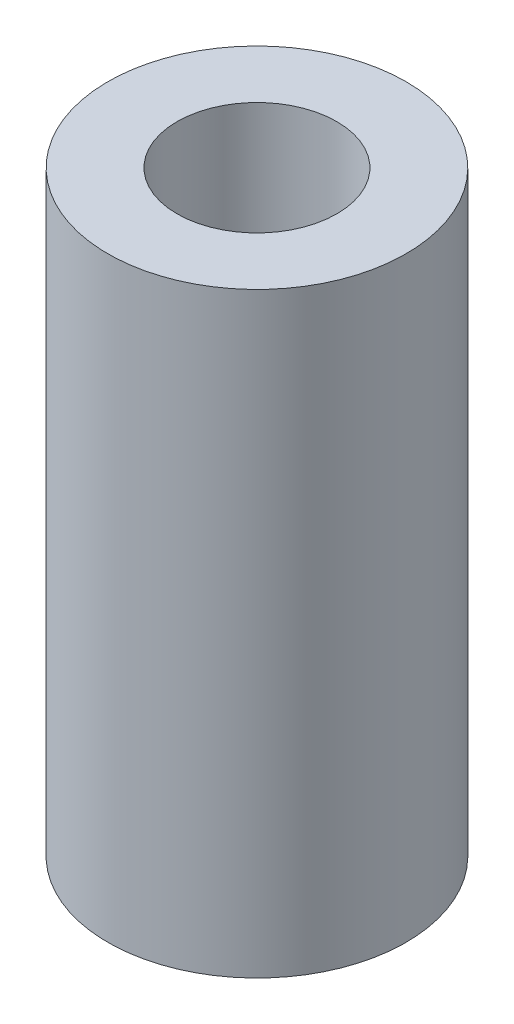
ISO-10303-21;
HEADER;
FILE_DESCRIPTION(('STEP AP214'),'2;1');
FILE_NAME('part.step','',(''),(''),'','','');
FILE_SCHEMA(('AUTOMOTIVE_DESIGN { 1 0 10303 214 1 1 1 1 }'));
ENDSEC;
DATA;
#1=APPLICATION_CONTEXT('core data for automotive mechanical design processes');
#2=APPLICATION_PROTOCOL_DEFINITION('international standard','automotive_design',2000,#1);
#3=PRODUCT_CONTEXT('',#1,'mechanical');
#4=PRODUCT('Part','Part','',(#3));
#5=PRODUCT_RELATED_PRODUCT_CATEGORY('part','',(#4));
#6=PRODUCT_DEFINITION_FORMATION('','',#4);
#7=PRODUCT_DEFINITION_CONTEXT('part definition',#1,'design');
#8=PRODUCT_DEFINITION('design','',#6,#7);
#9=PRODUCT_DEFINITION_SHAPE('','',#8);
#10=(LENGTH_UNIT() NAMED_UNIT(*) SI_UNIT(.MILLI.,.METRE.));
#11=(NAMED_UNIT(*) PLANE_ANGLE_UNIT() SI_UNIT($,.RADIAN.));
#12=(NAMED_UNIT(*) SI_UNIT($,.STERADIAN.) SOLID_ANGLE_UNIT());
#13=UNCERTAINTY_MEASURE_WITH_UNIT(LENGTH_MEASURE(1.E-05),#10,'distance_accuracy_value','');
#14=(GEOMETRIC_REPRESENTATION_CONTEXT(3) GLOBAL_UNCERTAINTY_ASSIGNED_CONTEXT((#13)) GLOBAL_UNIT_ASSIGNED_CONTEXT((#10,
#11,#12)) REPRESENTATION_CONTEXT('',''));
#15=CARTESIAN_POINT('',(0.,0.,0.));
#16=DIRECTION('',(0.,0.,1.));
#17=DIRECTION('',(1.,0.,0.));
#18=AXIS2_PLACEMENT_3D('',#15,#16,#17);
#19=CARTESIAN_POINT('',(0.,19.05,0.));
#20=DIRECTION('',(0.,1.,0.));
#21=DIRECTION('',(0.,0.,1.));
#22=AXIS2_PLACEMENT_3D('',#19,#20,#21);
#23=PLANE('',#22);
#24=CARTESIAN_POINT('',(0.,19.05,0.));
#25=DIRECTION('',(0.,1.,0.));
#26=DIRECTION('',(0.,0.,1.));
#27=AXIS2_PLACEMENT_3D('',#24,#25,#26);
#28=CIRCLE('',#27,4.7625);
#29=CARTESIAN_POINT('',(0.,19.05,-4.7625));
#30=VERTEX_POINT('',#29);
#31=EDGE_CURVE('E10',#30,#30,#28,.T.);
#32=ORIENTED_EDGE('',*,*,#31,.T.);
#33=EDGE_LOOP('',(#32));
#34=FACE_BOUND('',#33,.T.);
#35=CARTESIAN_POINT('',(0.,19.05,0.));
#36=DIRECTION('',(0.,1.,0.));
#37=DIRECTION('',(0.,0.,1.));
#38=AXIS2_PLACEMENT_3D('',#35,#36,#37);
#39=CIRCLE('',#38,2.5527);
#40=CARTESIAN_POINT('',(0.,19.05,-2.5527));
#41=VERTEX_POINT('',#40);
#42=EDGE_CURVE('E54',#41,#41,#39,.T.);
#43=ORIENTED_EDGE('',*,*,#42,.F.);
#44=EDGE_LOOP('',(#43));
#45=FACE_BOUND('',#44,.T.);
#46=ADVANCED_FACE('F41',(#34,#45),#23,.T.);
#47=CARTESIAN_POINT('',(0.,0.,0.));
#48=DIRECTION('',(0.,1.,0.));
#49=DIRECTION('',(0.,0.,1.));
#50=AXIS2_PLACEMENT_3D('',#47,#48,#49);
#51=PLANE('',#50);
#52=CARTESIAN_POINT('',(0.,0.,0.));
#53=DIRECTION('',(0.,1.,0.));
#54=DIRECTION('',(0.,0.,1.));
#55=AXIS2_PLACEMENT_3D('',#52,#53,#54);
#56=CIRCLE('',#55,4.7625);
#57=CARTESIAN_POINT('',(0.,0.,-4.7625));
#58=VERTEX_POINT('',#57);
#59=EDGE_CURVE('E45',#58,#58,#56,.T.);
#60=ORIENTED_EDGE('',*,*,#59,.F.);
#61=EDGE_LOOP('',(#60));
#62=FACE_BOUND('',#61,.T.);
#63=CARTESIAN_POINT('',(0.,0.,0.));
#64=DIRECTION('',(0.,1.,0.));
#65=DIRECTION('',(0.,0.,1.));
#66=AXIS2_PLACEMENT_3D('',#63,#64,#65);
#67=CIRCLE('',#66,2.5527);
#68=CARTESIAN_POINT('',(0.,0.,-2.5527));
#69=VERTEX_POINT('',#68);
#70=EDGE_CURVE('E56',#69,#69,#67,.T.);
#71=ORIENTED_EDGE('',*,*,#70,.T.);
#72=EDGE_LOOP('',(#71));
#73=FACE_BOUND('',#72,.T.);
#74=ADVANCED_FACE('F68',(#62,#73),#51,.F.);
#75=CARTESIAN_POINT('',(0.,19.05,0.));
#76=DIRECTION('',(0.,-1.,0.));
#77=DIRECTION('',(0.,0.,-1.));
#78=AXIS2_PLACEMENT_3D('',#75,#76,#77);
#79=CYLINDRICAL_SURFACE('',#78,4.7625);
#80=CARTESIAN_POINT('',(0.,19.05,-4.7625));
#81=CARTESIAN_POINT('',(0.,18.8515625,-4.7625));
#82=CARTESIAN_POINT('',(0.,18.653125,-4.7625));
#83=CARTESIAN_POINT('',(0.,18.25625,-4.7625));
#84=CARTESIAN_POINT('',(0.,18.0578125,-4.7625));
#85=CARTESIAN_POINT('',(0.,17.6609375,-4.7625));
#86=CARTESIAN_POINT('',(0.,17.4625,-4.7625));
#87=CARTESIAN_POINT('',(0.,17.065625,-4.7625));
#88=CARTESIAN_POINT('',(0.,16.8671875,-4.7625));
#89=CARTESIAN_POINT('',(0.,16.4703125,-4.7625));
#90=CARTESIAN_POINT('',(0.,16.271875,-4.7625));
#91=CARTESIAN_POINT('',(0.,15.875,-4.7625));
#92=CARTESIAN_POINT('',(0.,15.6765625,-4.7625));
#93=CARTESIAN_POINT('',(0.,15.2796875,-4.7625));
#94=CARTESIAN_POINT('',(0.,15.08125,-4.7625));
#95=CARTESIAN_POINT('',(0.,14.684375,-4.7625));
#96=CARTESIAN_POINT('',(0.,14.4859375,-4.7625));
#97=CARTESIAN_POINT('',(0.,14.0890625,-4.7625));
#98=CARTESIAN_POINT('',(0.,13.890625,-4.7625));
#99=CARTESIAN_POINT('',(0.,13.49375,-4.7625));
#100=CARTESIAN_POINT('',(0.,13.2953125,-4.7625));
#101=CARTESIAN_POINT('',(0.,12.8984375,-4.7625));
#102=CARTESIAN_POINT('',(0.,12.7,-4.7625));
#103=CARTESIAN_POINT('',(0.,12.303125,-4.7625));
#104=CARTESIAN_POINT('',(0.,12.1046875,-4.7625));
#105=CARTESIAN_POINT('',(0.,11.7078125,-4.7625));
#106=CARTESIAN_POINT('',(0.,11.509375,-4.7625));
#107=CARTESIAN_POINT('',(0.,11.1125,-4.7625));
#108=CARTESIAN_POINT('',(0.,10.9140625,-4.7625));
#109=CARTESIAN_POINT('',(0.,10.5171875,-4.7625));
#110=CARTESIAN_POINT('',(0.,10.31875,-4.7625));
#111=CARTESIAN_POINT('',(0.,9.921875,-4.7625));
#112=CARTESIAN_POINT('',(0.,9.7234375,-4.7625));
#113=CARTESIAN_POINT('',(0.,9.3265625,-4.7625));
#114=CARTESIAN_POINT('',(0.,9.128125,-4.7625));
#115=CARTESIAN_POINT('',(0.,8.73125,-4.7625));
#116=CARTESIAN_POINT('',(0.,8.5328125,-4.7625));
#117=CARTESIAN_POINT('',(0.,8.1359375,-4.7625));
#118=CARTESIAN_POINT('',(0.,7.9375,-4.7625));
#119=CARTESIAN_POINT('',(0.,7.540625,-4.7625));
#120=CARTESIAN_POINT('',(0.,7.3421875,-4.7625));
#121=CARTESIAN_POINT('',(0.,6.9453125,-4.7625));
#122=CARTESIAN_POINT('',(0.,6.746875,-4.7625));
#123=CARTESIAN_POINT('',(0.,6.35,-4.7625));
#124=CARTESIAN_POINT('',(0.,6.1515625,-4.7625));
#125=CARTESIAN_POINT('',(0.,5.7546875,-4.7625));
#126=CARTESIAN_POINT('',(0.,5.55625,-4.7625));
#127=CARTESIAN_POINT('',(0.,5.159375,-4.7625));
#128=CARTESIAN_POINT('',(0.,4.9609375,-4.7625));
#129=CARTESIAN_POINT('',(0.,4.5640625,-4.7625));
#130=CARTESIAN_POINT('',(0.,4.365625,-4.7625));
#131=CARTESIAN_POINT('',(0.,3.96875,-4.7625));
#132=CARTESIAN_POINT('',(0.,3.7703125,-4.7625));
#133=CARTESIAN_POINT('',(0.,3.3734375,-4.7625));
#134=CARTESIAN_POINT('',(0.,3.175,-4.7625));
#135=CARTESIAN_POINT('',(0.,2.778125,-4.7625));
#136=CARTESIAN_POINT('',(0.,2.5796875,-4.7625));
#137=CARTESIAN_POINT('',(0.,2.1828125,-4.7625));
#138=CARTESIAN_POINT('',(0.,1.984375,-4.7625));
#139=CARTESIAN_POINT('',(0.,1.5875,-4.7625));
#140=CARTESIAN_POINT('',(0.,1.3890625,-4.7625));
#141=CARTESIAN_POINT('',(0.,0.992187500000001,-4.7625));
#142=CARTESIAN_POINT('',(0.,0.793750000000001,-4.7625));
#143=CARTESIAN_POINT('',(0.,0.396875,-4.7625));
#144=CARTESIAN_POINT('',(0.,0.1984375,-4.7625));
#145=CARTESIAN_POINT('',(0.,0.,-4.7625));
#146=B_SPLINE_CURVE_WITH_KNOTS('',3,(#80,#81,#82,#83,#84,#85,#86,#87,#88,#89,#90,#91,#92,#93,
#94,#95,#96,#97,#98,#99,#100,#101,#102,#103,#104,#105,#106,#107,#108,#109,#110,#111,#112,#113,
#114,#115,#116,#117,#118,#119,#120,#121,#122,#123,#124,#125,#126,#127,#128,#129,#130,#131,#132,
#133,#134,#135,#136,#137,#138,#139,#140,#141,#142,#143,#144,#145),.UNSPECIFIED.,.F.,.F.,(4,2,2,
2,2,2,2,2,2,2,2,2,2,2,2,2,2,2,2,2,2,2,2,2,2,2,2,2,2,2,2,2,4),(0.,0.5953125,1.190625,1.7859375,
2.38125,2.9765625,3.571875,4.1671875,4.7625,5.3578125,5.953125,6.5484375,7.14375,7.7390625,
8.334375,8.9296875,9.525,10.1203125,10.715625,11.3109375,11.90625,12.5015625,13.096875,
13.6921875,14.2875,14.8828125,15.478125,16.0734375,16.66875,17.2640625,17.859375,18.4546875,
19.05),.UNSPECIFIED.);
#147=EDGE_CURVE('BSEAM43',#30,#58,#146,.T.);
#148=ORIENTED_EDGE('',*,*,#31,.F.);
#149=ORIENTED_EDGE('',*,*,#59,.T.);
#150=ORIENTED_EDGE('',*,*,#147,.T.);
#151=ORIENTED_EDGE('',*,*,#147,.F.);
#152=EDGE_LOOP('',(#148,#150,#149,#151));
#153=FACE_BOUND('',#152,.T.);
#154=ADVANCED_FACE('F43',(#153),#79,.T.);
#155=CARTESIAN_POINT('',(0.,19.05,0.));
#156=DIRECTION('',(0.,-1.,0.));
#157=DIRECTION('',(0.,0.,-1.));
#158=AXIS2_PLACEMENT_3D('',#155,#156,#157);
#159=CYLINDRICAL_SURFACE('',#158,2.5527);
#160=CARTESIAN_POINT('',(0.,19.05,-2.5527));
#161=CARTESIAN_POINT('',(0.,18.8515625,-2.5527));
#162=CARTESIAN_POINT('',(0.,18.653125,-2.5527));
#163=CARTESIAN_POINT('',(0.,18.25625,-2.5527));
#164=CARTESIAN_POINT('',(0.,18.0578125,-2.5527));
#165=CARTESIAN_POINT('',(0.,17.6609375,-2.5527));
#166=CARTESIAN_POINT('',(0.,17.4625,-2.5527));
#167=CARTESIAN_POINT('',(0.,17.065625,-2.5527));
#168=CARTESIAN_POINT('',(0.,16.8671875,-2.5527));
#169=CARTESIAN_POINT('',(0.,16.4703125,-2.5527));
#170=CARTESIAN_POINT('',(0.,16.271875,-2.5527));
#171=CARTESIAN_POINT('',(0.,15.875,-2.5527));
#172=CARTESIAN_POINT('',(0.,15.6765625,-2.5527));
#173=CARTESIAN_POINT('',(0.,15.2796875,-2.5527));
#174=CARTESIAN_POINT('',(0.,15.08125,-2.5527));
#175=CARTESIAN_POINT('',(0.,14.684375,-2.5527));
#176=CARTESIAN_POINT('',(0.,14.4859375,-2.5527));
#177=CARTESIAN_POINT('',(0.,14.0890625,-2.5527));
#178=CARTESIAN_POINT('',(0.,13.890625,-2.5527));
#179=CARTESIAN_POINT('',(0.,13.49375,-2.5527));
#180=CARTESIAN_POINT('',(0.,13.2953125,-2.5527));
#181=CARTESIAN_POINT('',(0.,12.8984375,-2.5527));
#182=CARTESIAN_POINT('',(0.,12.7,-2.5527));
#183=CARTESIAN_POINT('',(0.,12.303125,-2.5527));
#184=CARTESIAN_POINT('',(0.,12.1046875,-2.5527));
#185=CARTESIAN_POINT('',(0.,11.7078125,-2.5527));
#186=CARTESIAN_POINT('',(0.,11.509375,-2.5527));
#187=CARTESIAN_POINT('',(0.,11.1125,-2.5527));
#188=CARTESIAN_POINT('',(0.,10.9140625,-2.5527));
#189=CARTESIAN_POINT('',(0.,10.5171875,-2.5527));
#190=CARTESIAN_POINT('',(0.,10.31875,-2.5527));
#191=CARTESIAN_POINT('',(0.,9.921875,-2.5527));
#192=CARTESIAN_POINT('',(0.,9.7234375,-2.5527));
#193=CARTESIAN_POINT('',(0.,9.3265625,-2.5527));
#194=CARTESIAN_POINT('',(0.,9.128125,-2.5527));
#195=CARTESIAN_POINT('',(0.,8.73125,-2.5527));
#196=CARTESIAN_POINT('',(0.,8.5328125,-2.5527));
#197=CARTESIAN_POINT('',(0.,8.1359375,-2.5527));
#198=CARTESIAN_POINT('',(0.,7.9375,-2.5527));
#199=CARTESIAN_POINT('',(0.,7.540625,-2.5527));
#200=CARTESIAN_POINT('',(0.,7.3421875,-2.5527));
#201=CARTESIAN_POINT('',(0.,6.9453125,-2.5527));
#202=CARTESIAN_POINT('',(0.,6.746875,-2.5527));
#203=CARTESIAN_POINT('',(0.,6.35,-2.5527));
#204=CARTESIAN_POINT('',(0.,6.1515625,-2.5527));
#205=CARTESIAN_POINT('',(0.,5.7546875,-2.5527));
#206=CARTESIAN_POINT('',(0.,5.55625,-2.5527));
#207=CARTESIAN_POINT('',(0.,5.159375,-2.5527));
#208=CARTESIAN_POINT('',(0.,4.9609375,-2.5527));
#209=CARTESIAN_POINT('',(0.,4.5640625,-2.5527));
#210=CARTESIAN_POINT('',(0.,4.365625,-2.5527));
#211=CARTESIAN_POINT('',(0.,3.96875,-2.5527));
#212=CARTESIAN_POINT('',(0.,3.7703125,-2.5527));
#213=CARTESIAN_POINT('',(0.,3.3734375,-2.5527));
#214=CARTESIAN_POINT('',(0.,3.175,-2.5527));
#215=CARTESIAN_POINT('',(0.,2.778125,-2.5527));
#216=CARTESIAN_POINT('',(0.,2.5796875,-2.5527));
#217=CARTESIAN_POINT('',(0.,2.1828125,-2.5527));
#218=CARTESIAN_POINT('',(0.,1.984375,-2.5527));
#219=CARTESIAN_POINT('',(0.,1.5875,-2.5527));
#220=CARTESIAN_POINT('',(0.,1.3890625,-2.5527));
#221=CARTESIAN_POINT('',(0.,0.992187500000001,-2.5527));
#222=CARTESIAN_POINT('',(0.,0.793750000000001,-2.5527));
#223=CARTESIAN_POINT('',(0.,0.396875,-2.5527));
#224=CARTESIAN_POINT('',(0.,0.1984375,-2.5527));
#225=CARTESIAN_POINT('',(0.,0.,-2.5527));
#226=B_SPLINE_CURVE_WITH_KNOTS('',3,(#160,#161,#162,#163,#164,#165,#166,#167,#168,#169,#170,
#171,#172,#173,#174,#175,#176,#177,#178,#179,#180,#181,#182,#183,#184,#185,#186,#187,#188,#189,
#190,#191,#192,#193,#194,#195,#196,#197,#198,#199,#200,#201,#202,#203,#204,#205,#206,#207,#208,
#209,#210,#211,#212,#213,#214,#215,#216,#217,#218,#219,#220,#221,#222,#223,#224,#225),
.UNSPECIFIED.,.F.,.F.,(4,2,2,2,2,2,2,2,2,2,2,2,2,2,2,2,2,2,2,2,2,2,2,2,2,2,2,2,2,2,2,2,4),(0.,
0.595312499999997,1.190625,1.7859375,2.38125,2.9765625,3.571875,4.1671875,4.7625,5.3578125,
5.953125,6.5484375,7.14375,7.7390625,8.334375,8.9296875,9.525,10.1203125,10.715625,11.3109375,
11.90625,12.5015625,13.096875,13.6921875,14.2875,14.8828125,15.478125,16.0734375,16.66875,
17.2640625,17.859375,18.4546875,19.05),.UNSPECIFIED.);
#227=EDGE_CURVE('BSEAM64',#41,#69,#226,.T.);
#228=ORIENTED_EDGE('',*,*,#42,.T.);
#229=ORIENTED_EDGE('',*,*,#70,.F.);
#230=ORIENTED_EDGE('',*,*,#227,.T.);
#231=ORIENTED_EDGE('',*,*,#227,.F.);
#232=EDGE_LOOP('',(#228,#230,#229,#231));
#233=FACE_BOUND('',#232,.T.);
#234=ADVANCED_FACE('F64',(#233),#159,.F.);
#235=CLOSED_SHELL('',(#46,#74,#154,#234));
#236=MANIFOLD_SOLID_BREP('B2',#235);
#237=ADVANCED_BREP_SHAPE_REPRESENTATION('',(#18,#236),#14);
#238=SHAPE_DEFINITION_REPRESENTATION(#9,#237);
ENDSEC;
END-ISO-10303-21;
